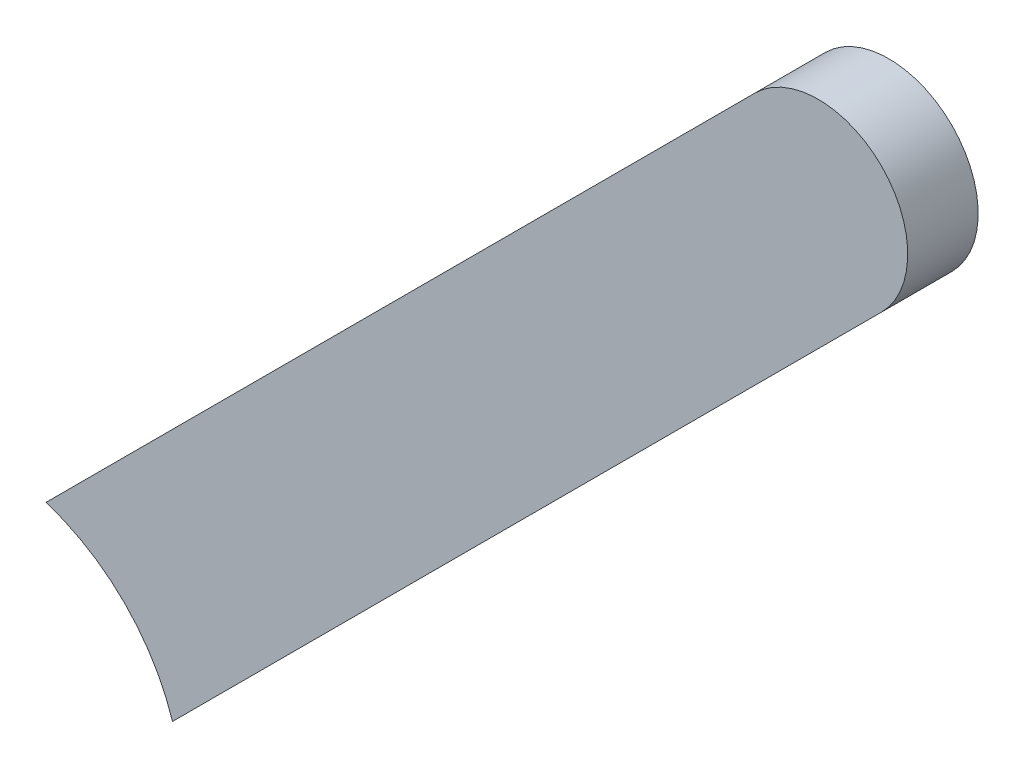
ISO-10303-21;
HEADER;
FILE_DESCRIPTION(('STEP AP214'),'2;1');
FILE_NAME('part.step','',(''),(''),'','','');
FILE_SCHEMA(('AUTOMOTIVE_DESIGN { 1 0 10303 214 1 1 1 1 }'));
ENDSEC;
DATA;
#1=APPLICATION_CONTEXT('core data for automotive mechanical design processes');
#2=APPLICATION_PROTOCOL_DEFINITION('international standard','automotive_design',2000,#1);
#3=PRODUCT_CONTEXT('',#1,'mechanical');
#4=PRODUCT('Part','Part','',(#3));
#5=PRODUCT_RELATED_PRODUCT_CATEGORY('part','',(#4));
#6=PRODUCT_DEFINITION_FORMATION('','',#4);
#7=PRODUCT_DEFINITION_CONTEXT('part definition',#1,'design');
#8=PRODUCT_DEFINITION('design','',#6,#7);
#9=PRODUCT_DEFINITION_SHAPE('','',#8);
#10=(LENGTH_UNIT() NAMED_UNIT(*) SI_UNIT(.MILLI.,.METRE.));
#11=(NAMED_UNIT(*) PLANE_ANGLE_UNIT() SI_UNIT($,.RADIAN.));
#12=(NAMED_UNIT(*) SI_UNIT($,.STERADIAN.) SOLID_ANGLE_UNIT());
#13=UNCERTAINTY_MEASURE_WITH_UNIT(LENGTH_MEASURE(1.E-05),#10,'distance_accuracy_value','');
#14=(GEOMETRIC_REPRESENTATION_CONTEXT(3) GLOBAL_UNCERTAINTY_ASSIGNED_CONTEXT((#13)) GLOBAL_UNIT_ASSIGNED_CONTEXT((#10,
#11,#12)) REPRESENTATION_CONTEXT('',''));
#15=CARTESIAN_POINT('',(0.,0.,0.));
#16=DIRECTION('',(0.,0.,1.));
#17=DIRECTION('',(1.,0.,0.));
#18=AXIS2_PLACEMENT_3D('',#15,#16,#17);
#19=CARTESIAN_POINT('',(109.621538404847,83.4783318648469,0.));
#20=DIRECTION('',(-0.707106781186548,0.707106781186548,0.));
#21=DIRECTION('',(0.707106781186548,0.707106781186548,0.));
#22=AXIS2_PLACEMENT_3D('',#19,#20,#21);
#23=PLANE('',#22);
#24=DIRECTION('',(0.707106781186548,0.707106781186548,0.));
#25=VECTOR('',#24,1.);
#26=CARTESIAN_POINT('',(109.27260594,83.1293994,0.1999996));
#27=LINE('',#26,#25);
#28=CARTESIAN_POINT('',(109.621538404847,83.4783318648469,0.1999996));
#29=VERTEX_POINT('',#28);
#30=CARTESIAN_POINT('',(111.6348034,85.49159686,0.1999996));
#31=VERTEX_POINT('',#30);
#32=EDGE_CURVE('E11',#29,#31,#27,.T.);
#33=ORIENTED_EDGE('',*,*,#32,.F.);
#34=DIRECTION('',(0.,0.,1.));
#35=VECTOR('',#34,1.);
#36=CARTESIAN_POINT('',(109.621538404847,83.4783318648469,0.));
#37=LINE('',#36,#35);
#38=CARTESIAN_POINT('',(109.621538404847,83.4783318648469,0.));
#39=VERTEX_POINT('',#38);
#40=EDGE_CURVE('E24',#39,#29,#37,.T.);
#41=ORIENTED_EDGE('',*,*,#40,.F.);
#42=DIRECTION('',(0.707106781186548,0.707106781186548,0.));
#43=VECTOR('',#42,1.);
#44=CARTESIAN_POINT('',(109.27260594,83.1293994,0.));
#45=LINE('',#44,#43);
#46=CARTESIAN_POINT('',(111.6348034,85.49159686,0.));
#47=VERTEX_POINT('',#46);
#48=EDGE_CURVE('E75',#39,#47,#45,.T.);
#49=ORIENTED_EDGE('',*,*,#48,.T.);
#50=DIRECTION('',(0.,0.,1.));
#51=VECTOR('',#50,1.);
#52=CARTESIAN_POINT('',(111.6348034,85.49159686,0.));
#53=LINE('',#52,#51);
#54=EDGE_CURVE('E37',#47,#31,#53,.T.);
#55=ORIENTED_EDGE('',*,*,#54,.T.);
#56=EDGE_LOOP('',(#33,#41,#49,#55));
#57=FACE_BOUND('',#56,.T.);
#58=ADVANCED_FACE('F17',(#57),#23,.F.);
#59=CARTESIAN_POINT('',(111.45519873,85.67120153,0.));
#60=DIRECTION('',(0.,0.,-1.));
#61=DIRECTION('',(0.707106781186576,-0.70710678118652,0.));
#62=AXIS2_PLACEMENT_3D('',#59,#60,#61);
#63=CYLINDRICAL_SURFACE('',#62,0.253999360179546);
#64=CARTESIAN_POINT('',(111.45519873,85.67120153,0.1999996));
#65=DIRECTION('',(0.,0.,1.));
#66=DIRECTION('',(0.707106781186576,-0.70710678118652,0.));
#67=AXIS2_PLACEMENT_3D('',#64,#65,#66);
#68=CIRCLE('',#67,0.253999360179546);
#69=CARTESIAN_POINT('',(111.27559406,85.8508062,0.1999996));
#70=VERTEX_POINT('',#69);
#71=EDGE_CURVE('E83',#31,#70,#68,.T.);
#72=ORIENTED_EDGE('',*,*,#71,.F.);
#73=ORIENTED_EDGE('',*,*,#54,.F.);
#74=CARTESIAN_POINT('',(111.45519873,85.67120153,0.));
#75=DIRECTION('',(0.,0.,1.));
#76=DIRECTION('',(0.707106781186576,-0.70710678118652,0.));
#77=AXIS2_PLACEMENT_3D('',#74,#75,#76);
#78=CIRCLE('',#77,0.253999360179546);
#79=CARTESIAN_POINT('',(111.27559406,85.8508062,0.));
#80=VERTEX_POINT('',#79);
#81=EDGE_CURVE('E81',#47,#80,#78,.T.);
#82=ORIENTED_EDGE('',*,*,#81,.T.);
#83=DIRECTION('',(0.,0.,1.));
#84=VECTOR('',#83,1.);
#85=CARTESIAN_POINT('',(111.27559406,85.8508062,0.));
#86=LINE('',#85,#84);
#87=EDGE_CURVE('E67',#80,#70,#86,.T.);
#88=ORIENTED_EDGE('',*,*,#87,.T.);
#89=EDGE_LOOP('',(#72,#73,#82,#88));
#90=FACE_BOUND('',#89,.T.);
#91=ADVANCED_FACE('F89',(#90),#63,.T.);
#92=CARTESIAN_POINT('',(111.27559406,85.8508062,0.));
#93=DIRECTION('',(0.70710678118655,-0.707106781186545,0.));
#94=DIRECTION('',(-0.707106781186545,-0.70710678118655,0.));
#95=AXIS2_PLACEMENT_3D('',#92,#93,#94);
#96=PLANE('',#95);
#97=DIRECTION('',(-0.707106781186545,-0.70710678118655,0.));
#98=VECTOR('',#97,1.);
#99=CARTESIAN_POINT('',(111.27559406,85.8508062,0.1999996));
#100=LINE('',#99,#98);
#101=CARTESIAN_POINT('',(109.262329064847,83.8375412048469,0.1999996));
#102=VERTEX_POINT('',#101);
#103=EDGE_CURVE('E71',#70,#102,#100,.T.);
#104=ORIENTED_EDGE('',*,*,#103,.F.);
#105=ORIENTED_EDGE('',*,*,#87,.F.);
#106=DIRECTION('',(-0.707106781186545,-0.70710678118655,0.));
#107=VECTOR('',#106,1.);
#108=CARTESIAN_POINT('',(111.27559406,85.8508062,0.));
#109=LINE('',#108,#107);
#110=CARTESIAN_POINT('',(109.262329064847,83.8375412048469,0.));
#111=VERTEX_POINT('',#110);
#112=EDGE_CURVE('E63',#80,#111,#109,.T.);
#113=ORIENTED_EDGE('',*,*,#112,.T.);
#114=DIRECTION('',(0.,0.,1.));
#115=VECTOR('',#114,1.);
#116=CARTESIAN_POINT('',(109.262329064847,83.8375412048469,0.));
#117=LINE('',#116,#115);
#118=EDGE_CURVE('E53',#111,#102,#117,.T.);
#119=ORIENTED_EDGE('',*,*,#118,.T.);
#120=EDGE_LOOP('',(#104,#105,#113,#119));
#121=FACE_BOUND('',#120,.T.);
#122=ADVANCED_FACE('F66',(#121),#96,.F.);
#123=CARTESIAN_POINT('',(109.093,83.3090028,0.));
#124=DIRECTION('',(0.,0.,-1.));
#125=DIRECTION('',(1.,0.,0.));
#126=AXIS2_PLACEMENT_3D('',#123,#124,#125);
#127=CYLINDRICAL_SURFACE('',#126,0.55500016);
#128=ORIENTED_EDGE('',*,*,#40,.T.);
#129=CARTESIAN_POINT('',(109.093,83.3090028,0.1999996));
#130=DIRECTION('',(0.,0.,1.));
#131=DIRECTION('',(1.,0.,0.));
#132=AXIS2_PLACEMENT_3D('',#129,#130,#131);
#133=CIRCLE('',#132,0.55500016);
#134=EDGE_CURVE('E59',#29,#102,#133,.T.);
#135=ORIENTED_EDGE('',*,*,#134,.T.);
#136=ORIENTED_EDGE('',*,*,#118,.F.);
#137=CARTESIAN_POINT('',(109.093,83.3090028,0.));
#138=DIRECTION('',(0.,0.,1.));
#139=DIRECTION('',(1.,0.,0.));
#140=AXIS2_PLACEMENT_3D('',#137,#138,#139);
#141=CIRCLE('',#140,0.55500016);
#142=EDGE_CURVE('E57',#39,#111,#141,.T.);
#143=ORIENTED_EDGE('',*,*,#142,.F.);
#144=EDGE_LOOP('',(#128,#135,#136,#143));
#145=FACE_BOUND('',#144,.T.);
#146=ADVANCED_FACE('F55',(#145),#127,.F.);
#147=CARTESIAN_POINT('',(109.27260594,83.1293994,0.));
#148=DIRECTION('',(0.,0.,-1.));
#149=DIRECTION('',(-1.,0.,0.));
#150=AXIS2_PLACEMENT_3D('',#147,#148,#149);
#151=PLANE('',#150);
#152=ORIENTED_EDGE('',*,*,#48,.F.);
#153=ORIENTED_EDGE('',*,*,#142,.T.);
#154=ORIENTED_EDGE('',*,*,#112,.F.);
#155=ORIENTED_EDGE('',*,*,#81,.F.);
#156=EDGE_LOOP('',(#152,#153,#154,#155));
#157=FACE_BOUND('',#156,.T.);
#158=ADVANCED_FACE('F74',(#157),#151,.T.);
#159=CARTESIAN_POINT('',(109.27260594,83.1293994,0.1999996));
#160=DIRECTION('',(0.,0.,-1.));
#161=DIRECTION('',(-1.,0.,0.));
#162=AXIS2_PLACEMENT_3D('',#159,#160,#161);
#163=PLANE('',#162);
#164=ORIENTED_EDGE('',*,*,#134,.F.);
#165=ORIENTED_EDGE('',*,*,#32,.T.);
#166=ORIENTED_EDGE('',*,*,#71,.T.);
#167=ORIENTED_EDGE('',*,*,#103,.T.);
#168=EDGE_LOOP('',(#164,#165,#166,#167));
#169=FACE_BOUND('',#168,.T.);
#170=ADVANCED_FACE('F91',(#169),#163,.F.);
#171=CLOSED_SHELL('',(#58,#91,#122,#146,#158,#170));
#172=MANIFOLD_SOLID_BREP('B1',#171);
#173=ADVANCED_BREP_SHAPE_REPRESENTATION('',(#18,#172),#14);
#174=SHAPE_DEFINITION_REPRESENTATION(#9,#173);
ENDSEC;
END-ISO-10303-21;
